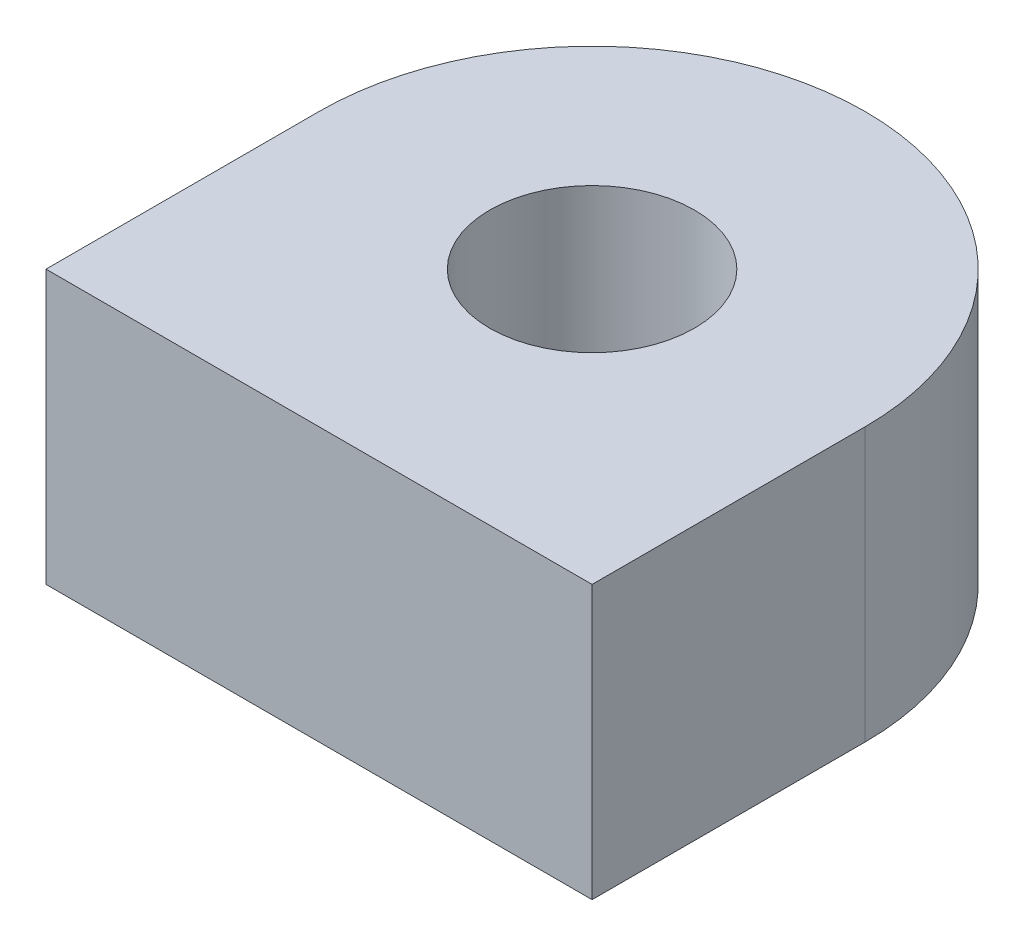
ISO-10303-21;
HEADER;
FILE_DESCRIPTION(('STEP AP214'),'2;1');
FILE_NAME('part.step','',(''),(''),'','','');
FILE_SCHEMA(('AUTOMOTIVE_DESIGN { 1 0 10303 214 1 1 1 1 }'));
ENDSEC;
DATA;
#1=APPLICATION_CONTEXT('core data for automotive mechanical design processes');
#2=APPLICATION_PROTOCOL_DEFINITION('international standard','automotive_design',2000,#1);
#3=PRODUCT_CONTEXT('',#1,'mechanical');
#4=PRODUCT('Part','Part','',(#3));
#5=PRODUCT_RELATED_PRODUCT_CATEGORY('part','',(#4));
#6=PRODUCT_DEFINITION_FORMATION('','',#4);
#7=PRODUCT_DEFINITION_CONTEXT('part definition',#1,'design');
#8=PRODUCT_DEFINITION('design','',#6,#7);
#9=PRODUCT_DEFINITION_SHAPE('','',#8);
#10=(LENGTH_UNIT() NAMED_UNIT(*) SI_UNIT(.MILLI.,.METRE.));
#11=(NAMED_UNIT(*) PLANE_ANGLE_UNIT() SI_UNIT($,.RADIAN.));
#12=(NAMED_UNIT(*) SI_UNIT($,.STERADIAN.) SOLID_ANGLE_UNIT());
#13=UNCERTAINTY_MEASURE_WITH_UNIT(LENGTH_MEASURE(1.E-05),#10,'distance_accuracy_value','');
#14=(GEOMETRIC_REPRESENTATION_CONTEXT(3) GLOBAL_UNCERTAINTY_ASSIGNED_CONTEXT((#13)) GLOBAL_UNIT_ASSIGNED_CONTEXT((#10,
#11,#12)) REPRESENTATION_CONTEXT('',''));
#15=CARTESIAN_POINT('',(0.,0.,0.));
#16=DIRECTION('',(0.,0.,1.));
#17=DIRECTION('',(1.,0.,0.));
#18=AXIS2_PLACEMENT_3D('',#15,#16,#17);
#19=CARTESIAN_POINT('',(0.,25.4,0.));
#20=DIRECTION('',(0.,1.,0.));
#21=DIRECTION('',(0.,0.,1.));
#22=AXIS2_PLACEMENT_3D('',#19,#20,#21);
#23=PLANE('',#22);
#24=CARTESIAN_POINT('',(0.,25.4,0.));
#25=DIRECTION('',(0.,1.,0.));
#26=DIRECTION('',(0.,0.,1.));
#27=AXIS2_PLACEMENT_3D('',#24,#25,#26);
#28=CIRCLE('',#27,25.4);
#29=CARTESIAN_POINT('',(25.4,25.4,0.));
#30=VERTEX_POINT('',#29);
#31=CARTESIAN_POINT('',(-25.4,25.4,0.));
#32=VERTEX_POINT('',#31);
#33=EDGE_CURVE('E85',#30,#32,#28,.T.);
#34=ORIENTED_EDGE('',*,*,#33,.T.);
#35=DIRECTION('',(0.,0.,1.));
#36=VECTOR('',#35,1.);
#37=CARTESIAN_POINT('',(-25.4,25.4,0.));
#38=LINE('',#37,#36);
#39=CARTESIAN_POINT('',(-25.4,25.4,25.4));
#40=VERTEX_POINT('',#39);
#41=EDGE_CURVE('E80',#32,#40,#38,.T.);
#42=ORIENTED_EDGE('',*,*,#41,.T.);
#43=DIRECTION('',(1.,0.,0.));
#44=VECTOR('',#43,1.);
#45=CARTESIAN_POINT('',(-25.4,25.4,25.4));
#46=LINE('',#45,#44);
#47=CARTESIAN_POINT('',(25.4,25.4,25.4));
#48=VERTEX_POINT('',#47);
#49=EDGE_CURVE('E83',#40,#48,#46,.T.);
#50=ORIENTED_EDGE('',*,*,#49,.T.);
#51=DIRECTION('',(0.,0.,-1.));
#52=VECTOR('',#51,1.);
#53=CARTESIAN_POINT('',(25.4,25.4,25.4));
#54=LINE('',#53,#52);
#55=EDGE_CURVE('E50',#48,#30,#54,.T.);
#56=ORIENTED_EDGE('',*,*,#55,.T.);
#57=EDGE_LOOP('',(#34,#42,#50,#56));
#58=FACE_BOUND('',#57,.T.);
#59=CARTESIAN_POINT('',(0.,25.4,0.));
#60=DIRECTION('',(0.,1.,0.));
#61=DIRECTION('',(0.,0.,1.));
#62=AXIS2_PLACEMENT_3D('',#59,#60,#61);
#63=CIRCLE('',#62,9.525);
#64=CARTESIAN_POINT('',(0.,25.4,9.525));
#65=VERTEX_POINT('',#64);
#66=EDGE_CURVE('E100',#65,#65,#63,.T.);
#67=ORIENTED_EDGE('',*,*,#66,.F.);
#68=EDGE_LOOP('',(#67));
#69=FACE_BOUND('',#68,.T.);
#70=ADVANCED_FACE('F33',(#58,#69),#23,.T.);
#71=CARTESIAN_POINT('',(0.,0.,0.));
#72=DIRECTION('',(0.,1.,0.));
#73=DIRECTION('',(0.,0.,1.));
#74=AXIS2_PLACEMENT_3D('',#71,#72,#73);
#75=PLANE('',#74);
#76=CARTESIAN_POINT('',(0.,0.,0.));
#77=DIRECTION('',(0.,1.,0.));
#78=DIRECTION('',(0.,0.,1.));
#79=AXIS2_PLACEMENT_3D('',#76,#77,#78);
#80=CIRCLE('',#79,25.4);
#81=CARTESIAN_POINT('',(25.4,0.,0.));
#82=VERTEX_POINT('',#81);
#83=CARTESIAN_POINT('',(-25.4,0.,0.));
#84=VERTEX_POINT('',#83);
#85=EDGE_CURVE('E97',#82,#84,#80,.T.);
#86=ORIENTED_EDGE('',*,*,#85,.F.);
#87=DIRECTION('',(0.,0.,-1.));
#88=VECTOR('',#87,1.);
#89=CARTESIAN_POINT('',(25.4,0.,25.4));
#90=LINE('',#89,#88);
#91=CARTESIAN_POINT('',(25.4,0.,25.4));
#92=VERTEX_POINT('',#91);
#93=EDGE_CURVE('E73',#92,#82,#90,.T.);
#94=ORIENTED_EDGE('',*,*,#93,.F.);
#95=DIRECTION('',(1.,0.,0.));
#96=VECTOR('',#95,1.);
#97=CARTESIAN_POINT('',(-25.4,0.,25.4));
#98=LINE('',#97,#96);
#99=CARTESIAN_POINT('',(-25.4,0.,25.4));
#100=VERTEX_POINT('',#99);
#101=EDGE_CURVE('E67',#100,#92,#98,.T.);
#102=ORIENTED_EDGE('',*,*,#101,.F.);
#103=DIRECTION('',(0.,0.,1.));
#104=VECTOR('',#103,1.);
#105=CARTESIAN_POINT('',(-25.4,0.,0.));
#106=LINE('',#105,#104);
#107=EDGE_CURVE('E89',#84,#100,#106,.T.);
#108=ORIENTED_EDGE('',*,*,#107,.F.);
#109=EDGE_LOOP('',(#86,#94,#102,#108));
#110=FACE_BOUND('',#109,.T.);
#111=CARTESIAN_POINT('',(0.,0.,0.));
#112=DIRECTION('',(0.,1.,0.));
#113=DIRECTION('',(0.,0.,1.));
#114=AXIS2_PLACEMENT_3D('',#111,#112,#113);
#115=CIRCLE('',#114,9.525);
#116=CARTESIAN_POINT('',(0.,0.,9.525));
#117=VERTEX_POINT('',#116);
#118=EDGE_CURVE('E112',#117,#117,#115,.T.);
#119=ORIENTED_EDGE('',*,*,#118,.T.);
#120=EDGE_LOOP('',(#119));
#121=FACE_BOUND('',#120,.T.);
#122=ADVANCED_FACE('F108',(#110,#121),#75,.F.);
#123=CARTESIAN_POINT('',(0.,25.4,0.));
#124=DIRECTION('',(0.,-1.,0.));
#125=DIRECTION('',(0.,0.,-1.));
#126=AXIS2_PLACEMENT_3D('',#123,#124,#125);
#127=CYLINDRICAL_SURFACE('',#126,25.4);
#128=ORIENTED_EDGE('',*,*,#85,.T.);
#129=DIRECTION('',(0.,-1.,0.));
#130=VECTOR('',#129,1.);
#131=CARTESIAN_POINT('',(-25.4,25.4,0.));
#132=LINE('',#131,#130);
#133=EDGE_CURVE('E11',#32,#84,#132,.T.);
#134=ORIENTED_EDGE('',*,*,#133,.F.);
#135=ORIENTED_EDGE('',*,*,#33,.F.);
#136=DIRECTION('',(0.,-1.,0.));
#137=VECTOR('',#136,1.);
#138=CARTESIAN_POINT('',(25.4,25.4,0.));
#139=LINE('',#138,#137);
#140=EDGE_CURVE('E93',#30,#82,#139,.T.);
#141=ORIENTED_EDGE('',*,*,#140,.T.);
#142=EDGE_LOOP('',(#128,#134,#135,#141));
#143=FACE_BOUND('',#142,.T.);
#144=ADVANCED_FACE('F35',(#143),#127,.T.);
#145=CARTESIAN_POINT('',(-25.4,25.4,0.));
#146=DIRECTION('',(1.,0.,0.));
#147=DIRECTION('',(0.,0.,-1.));
#148=AXIS2_PLACEMENT_3D('',#145,#146,#147);
#149=PLANE('',#148);
#150=ORIENTED_EDGE('',*,*,#107,.T.);
#151=DIRECTION('',(0.,-1.,0.));
#152=VECTOR('',#151,1.);
#153=CARTESIAN_POINT('',(-25.4,25.4,25.4));
#154=LINE('',#153,#152);
#155=EDGE_CURVE('E42',#40,#100,#154,.T.);
#156=ORIENTED_EDGE('',*,*,#155,.F.);
#157=ORIENTED_EDGE('',*,*,#41,.F.);
#158=ORIENTED_EDGE('',*,*,#133,.T.);
#159=EDGE_LOOP('',(#150,#156,#157,#158));
#160=FACE_BOUND('',#159,.T.);
#161=ADVANCED_FACE('F88',(#160),#149,.F.);
#162=CARTESIAN_POINT('',(-25.4,25.4,25.4));
#163=DIRECTION('',(0.,0.,-1.));
#164=DIRECTION('',(-1.,0.,0.));
#165=AXIS2_PLACEMENT_3D('',#162,#163,#164);
#166=PLANE('',#165);
#167=ORIENTED_EDGE('',*,*,#101,.T.);
#168=DIRECTION('',(0.,-1.,0.));
#169=VECTOR('',#168,1.);
#170=CARTESIAN_POINT('',(25.4,25.4,25.4));
#171=LINE('',#170,#169);
#172=EDGE_CURVE('E90',#48,#92,#171,.T.);
#173=ORIENTED_EDGE('',*,*,#172,.F.);
#174=ORIENTED_EDGE('',*,*,#49,.F.);
#175=ORIENTED_EDGE('',*,*,#155,.T.);
#176=EDGE_LOOP('',(#167,#173,#174,#175));
#177=FACE_BOUND('',#176,.T.);
#178=ADVANCED_FACE('F91',(#177),#166,.F.);
#179=CARTESIAN_POINT('',(25.4,25.4,25.4));
#180=DIRECTION('',(-1.,0.,0.));
#181=DIRECTION('',(0.,0.,1.));
#182=AXIS2_PLACEMENT_3D('',#179,#180,#181);
#183=PLANE('',#182);
#184=ORIENTED_EDGE('',*,*,#93,.T.);
#185=ORIENTED_EDGE('',*,*,#140,.F.);
#186=ORIENTED_EDGE('',*,*,#55,.F.);
#187=ORIENTED_EDGE('',*,*,#172,.T.);
#188=EDGE_LOOP('',(#184,#185,#186,#187));
#189=FACE_BOUND('',#188,.T.);
#190=ADVANCED_FACE('F105',(#189),#183,.F.);
#191=CARTESIAN_POINT('',(0.,25.4,0.));
#192=DIRECTION('',(0.,-1.,0.));
#193=DIRECTION('',(0.,0.,-1.));
#194=AXIS2_PLACEMENT_3D('',#191,#192,#193);
#195=CYLINDRICAL_SURFACE('',#194,9.525);
#196=ORIENTED_EDGE('',*,*,#66,.T.);
#197=EDGE_LOOP('',(#196));
#198=FACE_BOUND('',#197,.T.);
#199=ORIENTED_EDGE('',*,*,#118,.F.);
#200=EDGE_LOOP('',(#199));
#201=FACE_BOUND('',#200,.T.);
#202=ADVANCED_FACE('F118',(#198,#201),#195,.F.);
#203=CLOSED_SHELL('',(#70,#122,#144,#161,#178,#190,#202));
#204=MANIFOLD_SOLID_BREP('B2',#203);
#205=ADVANCED_BREP_SHAPE_REPRESENTATION('',(#18,#204),#14);
#206=SHAPE_DEFINITION_REPRESENTATION(#9,#205);
ENDSEC;
END-ISO-10303-21;
